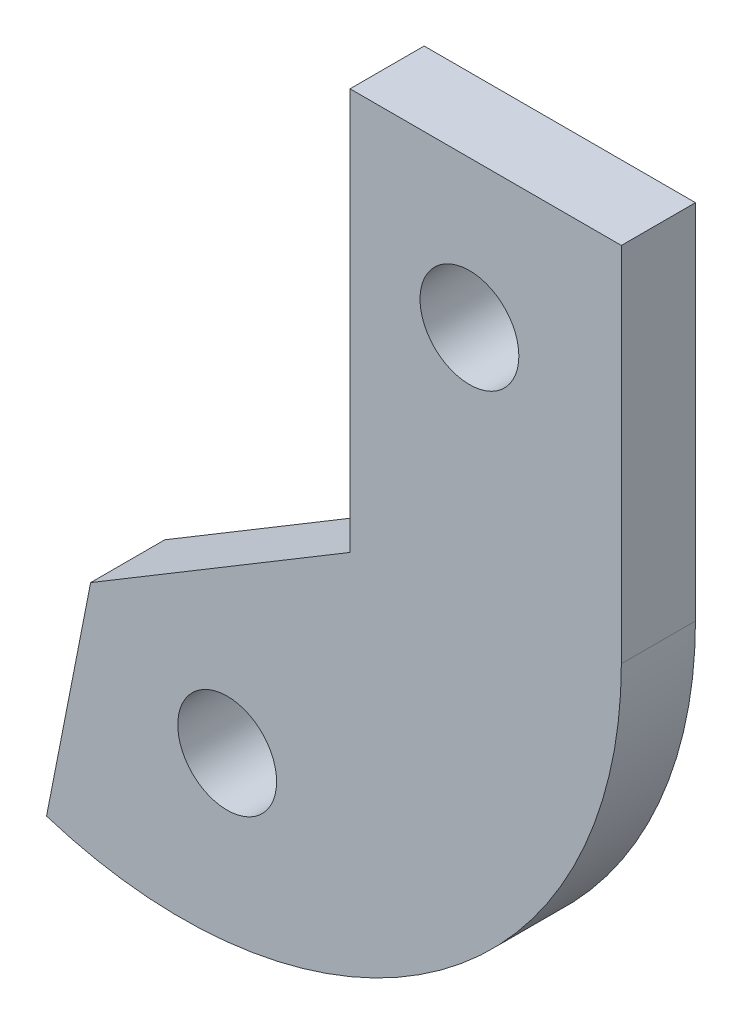
ISO-10303-21;
HEADER;
FILE_DESCRIPTION(('STEP AP214'),'2;1');
FILE_NAME('part.step','',(''),(''),'','','');
FILE_SCHEMA(('AUTOMOTIVE_DESIGN { 1 0 10303 214 1 1 1 1 }'));
ENDSEC;
DATA;
#1=APPLICATION_CONTEXT('core data for automotive mechanical design processes');
#2=APPLICATION_PROTOCOL_DEFINITION('international standard','automotive_design',2000,#1);
#3=PRODUCT_CONTEXT('',#1,'mechanical');
#4=PRODUCT('Part','Part','',(#3));
#5=PRODUCT_RELATED_PRODUCT_CATEGORY('part','',(#4));
#6=PRODUCT_DEFINITION_FORMATION('','',#4);
#7=PRODUCT_DEFINITION_CONTEXT('part definition',#1,'design');
#8=PRODUCT_DEFINITION('design','',#6,#7);
#9=PRODUCT_DEFINITION_SHAPE('','',#8);
#10=(LENGTH_UNIT() NAMED_UNIT(*) SI_UNIT(.MILLI.,.METRE.));
#11=(NAMED_UNIT(*) PLANE_ANGLE_UNIT() SI_UNIT($,.RADIAN.));
#12=(NAMED_UNIT(*) SI_UNIT($,.STERADIAN.) SOLID_ANGLE_UNIT());
#13=UNCERTAINTY_MEASURE_WITH_UNIT(LENGTH_MEASURE(1.E-05),#10,'distance_accuracy_value','');
#14=(GEOMETRIC_REPRESENTATION_CONTEXT(3) GLOBAL_UNCERTAINTY_ASSIGNED_CONTEXT((#13)) GLOBAL_UNIT_ASSIGNED_CONTEXT((#10,
#11,#12)) REPRESENTATION_CONTEXT('',''));
#15=CARTESIAN_POINT('',(0.,0.,0.));
#16=DIRECTION('',(0.,0.,1.));
#17=DIRECTION('',(1.,0.,0.));
#18=AXIS2_PLACEMENT_3D('',#15,#16,#17);
#19=CARTESIAN_POINT('',(2.17520257975725,-7.33231119350928,3.));
#20=DIRECTION('',(0.,0.,-1.));
#21=DIRECTION('',(-1.,0.,0.));
#22=AXIS2_PLACEMENT_3D('',#19,#20,#21);
#23=CYLINDRICAL_SURFACE('',#22,17.8247974202428);
#24=CARTESIAN_POINT('',(2.17520257975725,-7.33231119350928,0.));
#25=DIRECTION('',(0.,0.,1.));
#26=DIRECTION('',(1.,0.,0.));
#27=AXIS2_PLACEMENT_3D('',#24,#25,#26);
#28=CIRCLE('',#27,17.8247974202428);
#29=CARTESIAN_POINT('',(20.,-7.33231119350928,0.));
#30=VERTEX_POINT('',#29);
#31=CARTESIAN_POINT('',(-3.26719030982332,-24.3059308047806,0.));
#32=VERTEX_POINT('',#31);
#33=EDGE_CURVE('E130',#30,#32,#28,.F.);
#34=ORIENTED_EDGE('',*,*,#33,.F.);
#35=DIRECTION('',(0.,0.,-1.));
#36=VECTOR('',#35,1.);
#37=CARTESIAN_POINT('',(20.,-7.33231119350928,3.));
#38=LINE('',#37,#36);
#39=CARTESIAN_POINT('',(20.,-7.33231119350928,3.));
#40=VERTEX_POINT('',#39);
#41=EDGE_CURVE('E11',#40,#30,#38,.T.);
#42=ORIENTED_EDGE('',*,*,#41,.F.);
#43=CARTESIAN_POINT('',(2.17520257975725,-7.33231119350928,3.));
#44=DIRECTION('',(0.,0.,1.));
#45=DIRECTION('',(1.,0.,0.));
#46=AXIS2_PLACEMENT_3D('',#43,#44,#45);
#47=CIRCLE('',#46,17.8247974202428);
#48=CARTESIAN_POINT('',(-3.26719030982332,-24.3059308047806,3.));
#49=VERTEX_POINT('',#48);
#50=EDGE_CURVE('E190',#40,#49,#47,.F.);
#51=ORIENTED_EDGE('',*,*,#50,.T.);
#52=DIRECTION('',(0.,0.,-1.));
#53=VECTOR('',#52,1.);
#54=CARTESIAN_POINT('',(-3.26719030982332,-24.3059308047806,3.));
#55=LINE('',#54,#53);
#56=EDGE_CURVE('E83',#49,#32,#55,.T.);
#57=ORIENTED_EDGE('',*,*,#56,.T.);
#58=EDGE_LOOP('',(#34,#42,#51,#57));
#59=FACE_BOUND('',#58,.T.);
#60=ADVANCED_FACE('F37',(#59),#23,.T.);
#61=CARTESIAN_POINT('',(20.,0.,3.));
#62=DIRECTION('',(-1.,0.,0.));
#63=DIRECTION('',(0.,0.,1.));
#64=AXIS2_PLACEMENT_3D('',#61,#62,#63);
#65=PLANE('',#64);
#66=DIRECTION('',(0.,1.,0.));
#67=VECTOR('',#66,1.);
#68=CARTESIAN_POINT('',(20.,0.,0.));
#69=LINE('',#68,#67);
#70=CARTESIAN_POINT('',(20.,7.33231119350927,0.));
#71=VERTEX_POINT('',#70);
#72=EDGE_CURVE('E132',#30,#71,#69,.T.);
#73=ORIENTED_EDGE('',*,*,#72,.T.);
#74=DIRECTION('',(0.,0.,-1.));
#75=VECTOR('',#74,1.);
#76=CARTESIAN_POINT('',(20.,7.33231119350927,3.));
#77=LINE('',#76,#75);
#78=CARTESIAN_POINT('',(20.,7.33231119350927,3.));
#79=VERTEX_POINT('',#78);
#80=EDGE_CURVE('E46',#79,#71,#77,.T.);
#81=ORIENTED_EDGE('',*,*,#80,.F.);
#82=DIRECTION('',(0.,1.,0.));
#83=VECTOR('',#82,1.);
#84=CARTESIAN_POINT('',(20.,0.,3.));
#85=LINE('',#84,#83);
#86=EDGE_CURVE('E119',#40,#79,#85,.T.);
#87=ORIENTED_EDGE('',*,*,#86,.F.);
#88=ORIENTED_EDGE('',*,*,#41,.T.);
#89=EDGE_LOOP('',(#73,#81,#87,#88));
#90=FACE_BOUND('',#89,.T.);
#91=ADVANCED_FACE('F154',(#90),#65,.F.);
#92=CARTESIAN_POINT('',(0.,7.33231119350929,3.));
#93=DIRECTION('',(0.,1.,0.));
#94=DIRECTION('',(-1.,0.,0.));
#95=AXIS2_PLACEMENT_3D('',#92,#93,#94);
#96=PLANE('',#95);
#97=DIRECTION('',(1.,0.,0.));
#98=VECTOR('',#97,1.);
#99=CARTESIAN_POINT('',(0.,7.33231119350929,0.));
#100=LINE('',#99,#98);
#101=CARTESIAN_POINT('',(9.01795072137288,7.33231119350928,0.));
#102=VERTEX_POINT('',#101);
#103=EDGE_CURVE('E135',#102,#71,#100,.T.);
#104=ORIENTED_EDGE('',*,*,#103,.F.);
#105=DIRECTION('',(0.,0.,-1.));
#106=VECTOR('',#105,1.);
#107=CARTESIAN_POINT('',(9.01795072137288,7.33231119350928,3.));
#108=LINE('',#107,#106);
#109=CARTESIAN_POINT('',(9.01795072137288,7.33231119350928,3.));
#110=VERTEX_POINT('',#109);
#111=EDGE_CURVE('E106',#110,#102,#108,.T.);
#112=ORIENTED_EDGE('',*,*,#111,.F.);
#113=DIRECTION('',(1.,0.,0.));
#114=VECTOR('',#113,1.);
#115=CARTESIAN_POINT('',(0.,7.33231119350929,3.));
#116=LINE('',#115,#114);
#117=EDGE_CURVE('E117',#110,#79,#116,.T.);
#118=ORIENTED_EDGE('',*,*,#117,.T.);
#119=ORIENTED_EDGE('',*,*,#80,.T.);
#120=EDGE_LOOP('',(#104,#112,#118,#119));
#121=FACE_BOUND('',#120,.T.);
#122=ADVANCED_FACE('F151',(#121),#96,.T.);
#123=CARTESIAN_POINT('',(9.01795072137288,0.,3.));
#124=DIRECTION('',(-1.,0.,0.));
#125=DIRECTION('',(0.,0.,1.));
#126=AXIS2_PLACEMENT_3D('',#123,#124,#125);
#127=PLANE('',#126);
#128=DIRECTION('',(0.,1.,0.));
#129=VECTOR('',#128,1.);
#130=CARTESIAN_POINT('',(9.01795072137288,0.,0.));
#131=LINE('',#130,#129);
#132=CARTESIAN_POINT('',(9.01795072137288,-8.92022135673202,0.));
#133=VERTEX_POINT('',#132);
#134=EDGE_CURVE('E103',#133,#102,#131,.T.);
#135=ORIENTED_EDGE('',*,*,#134,.F.);
#136=DIRECTION('',(0.,0.,-1.));
#137=VECTOR('',#136,1.);
#138=CARTESIAN_POINT('',(9.01795072137288,-8.92022135673202,3.));
#139=LINE('',#138,#137);
#140=CARTESIAN_POINT('',(9.01795072137288,-8.92022135673202,3.));
#141=VERTEX_POINT('',#140);
#142=EDGE_CURVE('E97',#141,#133,#139,.T.);
#143=ORIENTED_EDGE('',*,*,#142,.F.);
#144=DIRECTION('',(0.,1.,0.));
#145=VECTOR('',#144,1.);
#146=CARTESIAN_POINT('',(9.01795072137288,0.,3.));
#147=LINE('',#146,#145);
#148=EDGE_CURVE('E101',#141,#110,#147,.T.);
#149=ORIENTED_EDGE('',*,*,#148,.T.);
#150=ORIENTED_EDGE('',*,*,#111,.T.);
#151=EDGE_LOOP('',(#135,#143,#149,#150));
#152=FACE_BOUND('',#151,.T.);
#153=ADVANCED_FACE('F99',(#152),#127,.T.);
#154=CARTESIAN_POINT('',(6.3286592549116,-10.5356515260313,3.));
#155=DIRECTION('',(0.514930533006054,-0.857231909215995,0.));
#156=DIRECTION('',(0.857231909215996,0.514930533006054,0.));
#157=AXIS2_PLACEMENT_3D('',#154,#155,#156);
#158=PLANE('',#157);
#159=DIRECTION('',(-0.857231909215996,-0.514930533006054,0.));
#160=VECTOR('',#159,1.);
#161=CARTESIAN_POINT('',(6.3286592549116,-10.5356515260313,0.));
#162=LINE('',#161,#160);
#163=CARTESIAN_POINT('',(-1.48253995503081,-15.2277598450867,0.));
#164=VERTEX_POINT('',#163);
#165=EDGE_CURVE('E139',#133,#164,#162,.T.);
#166=ORIENTED_EDGE('',*,*,#165,.T.);
#167=DIRECTION('',(0.,0.,-1.));
#168=VECTOR('',#167,1.);
#169=CARTESIAN_POINT('',(-1.48253995503081,-15.2277598450867,3.));
#170=LINE('',#169,#168);
#171=CARTESIAN_POINT('',(-1.48253995503081,-15.2277598450867,3.));
#172=VERTEX_POINT('',#171);
#173=EDGE_CURVE('E107',#172,#164,#170,.T.);
#174=ORIENTED_EDGE('',*,*,#173,.F.);
#175=DIRECTION('',(-0.857231909215996,-0.514930533006054,0.));
#176=VECTOR('',#175,1.);
#177=CARTESIAN_POINT('',(6.3286592549116,-10.5356515260313,3.));
#178=LINE('',#177,#176);
#179=EDGE_CURVE('E110',#141,#172,#178,.T.);
#180=ORIENTED_EDGE('',*,*,#179,.F.);
#181=ORIENTED_EDGE('',*,*,#142,.T.);
#182=EDGE_LOOP('',(#166,#174,#180,#181));
#183=FACE_BOUND('',#182,.T.);
#184=ADVANCED_FACE('F111',(#183),#158,.F.);
#185=CARTESIAN_POINT('',(1.45481612890392,-0.285997931977014,3.));
#186=DIRECTION('',(0.981219408883646,-0.192894975647445,0.));
#187=DIRECTION('',(0.192894975647445,0.981219408883646,0.));
#188=AXIS2_PLACEMENT_3D('',#185,#186,#187);
#189=PLANE('',#188);
#190=DIRECTION('',(-0.192894975647445,-0.981219408883646,0.));
#191=VECTOR('',#190,1.);
#192=CARTESIAN_POINT('',(1.45481612890392,-0.285997931977014,0.));
#193=LINE('',#192,#191);
#194=EDGE_CURVE('E76',#164,#32,#193,.T.);
#195=ORIENTED_EDGE('',*,*,#194,.T.);
#196=ORIENTED_EDGE('',*,*,#56,.F.);
#197=DIRECTION('',(-0.192894975647445,-0.981219408883646,0.));
#198=VECTOR('',#197,1.);
#199=CARTESIAN_POINT('',(1.45481612890392,-0.285997931977014,3.));
#200=LINE('',#199,#198);
#201=EDGE_CURVE('E54',#172,#49,#200,.T.);
#202=ORIENTED_EDGE('',*,*,#201,.F.);
#203=ORIENTED_EDGE('',*,*,#173,.T.);
#204=EDGE_LOOP('',(#195,#196,#202,#203));
#205=FACE_BOUND('',#204,.T.);
#206=ADVANCED_FACE('F172',(#205),#189,.F.);
#207=CARTESIAN_POINT('',(4.04532645237533,-18.4434255377461,3.));
#208=DIRECTION('',(0.,0.,-1.));
#209=DIRECTION('',(-1.,0.,0.));
#210=AXIS2_PLACEMENT_3D('',#207,#208,#209);
#211=CYLINDRICAL_SURFACE('',#210,2.);
#212=CARTESIAN_POINT('',(4.04532645237533,-18.4434255377461,3.));
#213=DIRECTION('',(0.,0.,1.));
#214=DIRECTION('',(1.,0.,0.));
#215=AXIS2_PLACEMENT_3D('',#212,#213,#214);
#216=CIRCLE('',#215,2.);
#217=CARTESIAN_POINT('',(6.04532645237534,-18.4434255377461,3.));
#218=VERTEX_POINT('',#217);
#219=EDGE_CURVE('E145',#218,#218,#216,.T.);
#220=ORIENTED_EDGE('',*,*,#219,.T.);
#221=EDGE_LOOP('',(#220));
#222=FACE_BOUND('',#221,.T.);
#223=CARTESIAN_POINT('',(4.04532645237533,-18.4434255377461,0.));
#224=DIRECTION('',(0.,0.,1.));
#225=DIRECTION('',(1.,0.,0.));
#226=AXIS2_PLACEMENT_3D('',#223,#224,#225);
#227=CIRCLE('',#226,2.);
#228=CARTESIAN_POINT('',(6.04532645237534,-18.4434255377461,0.));
#229=VERTEX_POINT('',#228);
#230=EDGE_CURVE('E127',#229,#229,#227,.T.);
#231=ORIENTED_EDGE('',*,*,#230,.F.);
#232=EDGE_LOOP('',(#231));
#233=FACE_BOUND('',#232,.T.);
#234=ADVANCED_FACE('F39',(#222,#233),#211,.F.);
#235=CARTESIAN_POINT('',(13.8510365706695,1.37921930106953,3.));
#236=DIRECTION('',(0.,0.,-1.));
#237=DIRECTION('',(-1.,0.,0.));
#238=AXIS2_PLACEMENT_3D('',#235,#236,#237);
#239=CYLINDRICAL_SURFACE('',#238,2.);
#240=CARTESIAN_POINT('',(13.8510365706695,1.37921930106953,3.));
#241=DIRECTION('',(0.,0.,1.));
#242=DIRECTION('',(1.,0.,0.));
#243=AXIS2_PLACEMENT_3D('',#240,#241,#242);
#244=CIRCLE('',#243,2.);
#245=CARTESIAN_POINT('',(15.8510365706695,1.37921930106953,3.));
#246=VERTEX_POINT('',#245);
#247=EDGE_CURVE('E124',#246,#246,#244,.T.);
#248=ORIENTED_EDGE('',*,*,#247,.T.);
#249=EDGE_LOOP('',(#248));
#250=FACE_BOUND('',#249,.T.);
#251=CARTESIAN_POINT('',(13.8510365706695,1.37921930106953,0.));
#252=DIRECTION('',(0.,0.,1.));
#253=DIRECTION('',(1.,0.,0.));
#254=AXIS2_PLACEMENT_3D('',#251,#252,#253);
#255=CIRCLE('',#254,2.);
#256=CARTESIAN_POINT('',(15.8510365706695,1.37921930106953,0.));
#257=VERTEX_POINT('',#256);
#258=EDGE_CURVE('E142',#257,#257,#255,.T.);
#259=ORIENTED_EDGE('',*,*,#258,.F.);
#260=EDGE_LOOP('',(#259));
#261=FACE_BOUND('',#260,.T.);
#262=ADVANCED_FACE('F162',(#250,#261),#239,.F.);
#263=CARTESIAN_POINT('',(0.,0.,3.));
#264=DIRECTION('',(0.,0.,1.));
#265=DIRECTION('',(1.,0.,0.));
#266=AXIS2_PLACEMENT_3D('',#263,#264,#265);
#267=PLANE('',#266);
#268=ORIENTED_EDGE('',*,*,#219,.F.);
#269=EDGE_LOOP('',(#268));
#270=FACE_BOUND('',#269,.T.);
#271=ORIENTED_EDGE('',*,*,#50,.F.);
#272=ORIENTED_EDGE('',*,*,#86,.T.);
#273=ORIENTED_EDGE('',*,*,#117,.F.);
#274=ORIENTED_EDGE('',*,*,#148,.F.);
#275=ORIENTED_EDGE('',*,*,#179,.T.);
#276=ORIENTED_EDGE('',*,*,#201,.T.);
#277=EDGE_LOOP('',(#271,#272,#273,#274,#275,#276));
#278=FACE_BOUND('',#277,.T.);
#279=ORIENTED_EDGE('',*,*,#247,.F.);
#280=EDGE_LOOP('',(#279));
#281=FACE_BOUND('',#280,.T.);
#282=ADVANCED_FACE('F114',(#270,#278,#281),#267,.T.);
#283=CARTESIAN_POINT('',(0.,0.,0.));
#284=DIRECTION('',(0.,0.,1.));
#285=DIRECTION('',(1.,0.,0.));
#286=AXIS2_PLACEMENT_3D('',#283,#284,#285);
#287=PLANE('',#286);
#288=ORIENTED_EDGE('',*,*,#230,.T.);
#289=EDGE_LOOP('',(#288));
#290=FACE_BOUND('',#289,.T.);
#291=ORIENTED_EDGE('',*,*,#33,.T.);
#292=ORIENTED_EDGE('',*,*,#194,.F.);
#293=ORIENTED_EDGE('',*,*,#165,.F.);
#294=ORIENTED_EDGE('',*,*,#134,.T.);
#295=ORIENTED_EDGE('',*,*,#103,.T.);
#296=ORIENTED_EDGE('',*,*,#72,.F.);
#297=EDGE_LOOP('',(#291,#292,#293,#294,#295,#296));
#298=FACE_BOUND('',#297,.T.);
#299=ORIENTED_EDGE('',*,*,#258,.T.);
#300=EDGE_LOOP('',(#299));
#301=FACE_BOUND('',#300,.T.);
#302=ADVANCED_FACE('F155',(#290,#298,#301),#287,.F.);
#303=CLOSED_SHELL('',(#60,#91,#122,#153,#184,#206,#234,#262,#282,#302));
#304=MANIFOLD_SOLID_BREP('B2',#303);
#305=ADVANCED_BREP_SHAPE_REPRESENTATION('',(#18,#304),#14);
#306=SHAPE_DEFINITION_REPRESENTATION(#9,#305);
ENDSEC;
END-ISO-10303-21;
